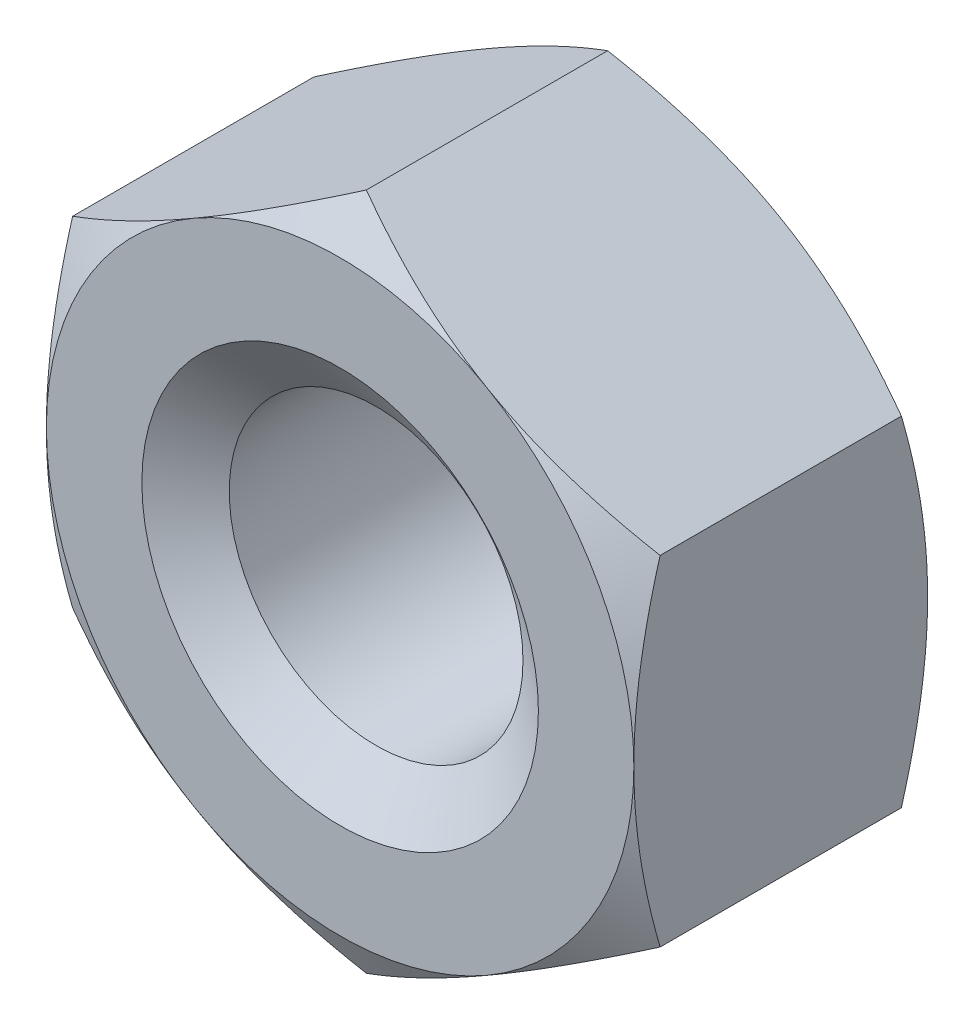
ISO-10303-21;
HEADER;
FILE_DESCRIPTION(('STEP AP214'),'2;1');
FILE_NAME('part.step','',(''),(''),'','','');
FILE_SCHEMA(('AUTOMOTIVE_DESIGN { 1 0 10303 214 1 1 1 1 }'));
ENDSEC;
DATA;
#1=APPLICATION_CONTEXT('core data for automotive mechanical design processes');
#2=APPLICATION_PROTOCOL_DEFINITION('international standard','automotive_design',2000,#1);
#3=PRODUCT_CONTEXT('',#1,'mechanical');
#4=PRODUCT('Part','Part','',(#3));
#5=PRODUCT_RELATED_PRODUCT_CATEGORY('part','',(#4));
#6=PRODUCT_DEFINITION_FORMATION('','',#4);
#7=PRODUCT_DEFINITION_CONTEXT('part definition',#1,'design');
#8=PRODUCT_DEFINITION('design','',#6,#7);
#9=PRODUCT_DEFINITION_SHAPE('','',#8);
#10=(LENGTH_UNIT() NAMED_UNIT(*) SI_UNIT(.MILLI.,.METRE.));
#11=(NAMED_UNIT(*) PLANE_ANGLE_UNIT() SI_UNIT($,.RADIAN.));
#12=(NAMED_UNIT(*) SI_UNIT($,.STERADIAN.) SOLID_ANGLE_UNIT());
#13=UNCERTAINTY_MEASURE_WITH_UNIT(LENGTH_MEASURE(1.E-05),#10,'distance_accuracy_value','');
#14=(GEOMETRIC_REPRESENTATION_CONTEXT(3) GLOBAL_UNCERTAINTY_ASSIGNED_CONTEXT((#13)) GLOBAL_UNIT_ASSIGNED_CONTEXT((#10,
#11,#12)) REPRESENTATION_CONTEXT('',''));
#15=CARTESIAN_POINT('',(0.,0.,0.));
#16=DIRECTION('',(0.,0.,1.));
#17=DIRECTION('',(1.,0.,0.));
#18=AXIS2_PLACEMENT_3D('',#15,#16,#17);
#19=CARTESIAN_POINT('',(0.,0.,-4.));
#20=DIRECTION('',(0.,0.,1.));
#21=DIRECTION('',(1.,0.,0.));
#22=AXIS2_PLACEMENT_3D('',#19,#20,#21);
#23=CYLINDRICAL_SURFACE('',#22,2.);
#24=CARTESIAN_POINT('',(0.,0.,-0.490145276746797));
#25=DIRECTION('',(0.,0.,1.));
#26=DIRECTION('',(1.,0.,0.));
#27=AXIS2_PLACEMENT_3D('',#24,#25,#26);
#28=CIRCLE('',#27,2.);
#29=CARTESIAN_POINT('',(2.,0.,-0.490145276746797));
#30=VERTEX_POINT('',#29);
#31=EDGE_CURVE('E175',#30,#30,#28,.F.);
#32=ORIENTED_EDGE('',*,*,#31,.F.);
#33=EDGE_LOOP('',(#32));
#34=FACE_BOUND('',#33,.T.);
#35=CARTESIAN_POINT('',(0.,0.,-3.4844547232532));
#36=DIRECTION('',(0.,0.,-1.));
#37=DIRECTION('',(-1.,0.,0.));
#38=AXIS2_PLACEMENT_3D('',#35,#36,#37);
#39=CIRCLE('',#38,2.);
#40=CARTESIAN_POINT('',(-2.,0.,-3.4844547232532));
#41=VERTEX_POINT('',#40);
#42=EDGE_CURVE('E40',#41,#41,#39,.F.);
#43=ORIENTED_EDGE('',*,*,#42,.F.);
#44=EDGE_LOOP('',(#43));
#45=FACE_BOUND('',#44,.T.);
#46=ADVANCED_FACE('F35',(#34,#45),#23,.F.);
#47=CARTESIAN_POINT('',(0.,4.61880215351701,-4.));
#48=DIRECTION('',(0.,0.,-1.));
#49=DIRECTION('',(-1.,0.,0.));
#50=AXIS2_PLACEMENT_3D('',#47,#48,#49);
#51=PLANE('',#50);
#52=CARTESIAN_POINT('',(0.,0.,-4.));
#53=DIRECTION('',(0.,0.,-1.));
#54=DIRECTION('',(-1.,0.,0.));
#55=AXIS2_PLACEMENT_3D('',#52,#53,#54);
#56=CIRCLE('',#55,4.);
#57=CARTESIAN_POINT('',(-4.,0.,-4.));
#58=VERTEX_POINT('',#57);
#59=CARTESIAN_POINT('',(-2.,-3.46410161513775,-4.));
#60=VERTEX_POINT('',#59);
#61=EDGE_CURVE('E171',#58,#60,#56,.F.);
#62=ORIENTED_EDGE('',*,*,#61,.F.);
#63=CARTESIAN_POINT('',(-2.00000000000001,3.46410161513775,-4.));
#64=VERTEX_POINT('',#63);
#65=EDGE_CURVE('E153',#64,#58,#56,.F.);
#66=ORIENTED_EDGE('',*,*,#65,.F.);
#67=CARTESIAN_POINT('',(2.,3.46410161513775,-4.));
#68=VERTEX_POINT('',#67);
#69=EDGE_CURVE('E170',#68,#64,#56,.F.);
#70=ORIENTED_EDGE('',*,*,#69,.F.);
#71=CARTESIAN_POINT('',(0.,0.,-4.));
#72=DIRECTION('',(0.,0.,1.));
#73=DIRECTION('',(1.,0.,0.));
#74=AXIS2_PLACEMENT_3D('',#71,#72,#73);
#75=CIRCLE('',#74,4.);
#76=CARTESIAN_POINT('',(4.,0.,-4.));
#77=VERTEX_POINT('',#76);
#78=EDGE_CURVE('E245',#77,#68,#75,.T.);
#79=ORIENTED_EDGE('',*,*,#78,.F.);
#80=CARTESIAN_POINT('',(2.,-3.46410161513775,-4.));
#81=VERTEX_POINT('',#80);
#82=EDGE_CURVE('E361',#81,#77,#56,.F.);
#83=ORIENTED_EDGE('',*,*,#82,.F.);
#84=EDGE_CURVE('E365',#60,#81,#56,.F.);
#85=ORIENTED_EDGE('',*,*,#84,.F.);
#86=EDGE_LOOP('',(#62,#66,#70,#79,#83,#85));
#87=FACE_BOUND('',#86,.T.);
#88=CARTESIAN_POINT('',(0.,0.,-4.));
#89=DIRECTION('',(0.,0.,-1.));
#90=DIRECTION('',(-1.,0.,0.));
#91=AXIS2_PLACEMENT_3D('',#88,#89,#90);
#92=CIRCLE('',#91,2.7);
#93=CARTESIAN_POINT('',(-2.7,0.,-4.));
#94=VERTEX_POINT('',#93);
#95=EDGE_CURVE('E178',#94,#94,#92,.F.);
#96=ORIENTED_EDGE('',*,*,#95,.T.);
#97=EDGE_LOOP('',(#96));
#98=FACE_BOUND('',#97,.T.);
#99=ADVANCED_FACE('F298',(#87,#98),#51,.T.);
#100=CARTESIAN_POINT('',(0.,4.61880215351701,0.));
#101=DIRECTION('',(0.,0.,-1.));
#102=DIRECTION('',(-1.,0.,0.));
#103=AXIS2_PLACEMENT_3D('',#100,#101,#102);
#104=PLANE('',#103);
#105=CARTESIAN_POINT('',(0.,0.,0.));
#106=DIRECTION('',(0.,0.,-1.));
#107=DIRECTION('',(-1.,0.,0.));
#108=AXIS2_PLACEMENT_3D('',#105,#106,#107);
#109=CIRCLE('',#108,4.);
#110=CARTESIAN_POINT('',(-4.,0.,0.));
#111=VERTEX_POINT('',#110);
#112=CARTESIAN_POINT('',(-2.00000000000001,3.46410161513775,0.));
#113=VERTEX_POINT('',#112);
#114=EDGE_CURVE('E11',#111,#113,#109,.T.);
#115=ORIENTED_EDGE('',*,*,#114,.F.);
#116=CARTESIAN_POINT('',(-2.,-3.46410161513775,0.));
#117=VERTEX_POINT('',#116);
#118=EDGE_CURVE('E47',#117,#111,#109,.T.);
#119=ORIENTED_EDGE('',*,*,#118,.F.);
#120=CARTESIAN_POINT('',(2.,-3.46410161513775,0.));
#121=VERTEX_POINT('',#120);
#122=EDGE_CURVE('E174',#121,#117,#109,.T.);
#123=ORIENTED_EDGE('',*,*,#122,.F.);
#124=CARTESIAN_POINT('',(4.,0.,0.));
#125=VERTEX_POINT('',#124);
#126=EDGE_CURVE('E352',#125,#121,#109,.T.);
#127=ORIENTED_EDGE('',*,*,#126,.F.);
#128=CARTESIAN_POINT('',(0.,0.,0.));
#129=DIRECTION('',(0.,0.,1.));
#130=DIRECTION('',(1.,0.,0.));
#131=AXIS2_PLACEMENT_3D('',#128,#129,#130);
#132=CIRCLE('',#131,4.);
#133=CARTESIAN_POINT('',(2.,3.46410161513775,0.));
#134=VERTEX_POINT('',#133);
#135=EDGE_CURVE('E129',#125,#134,#132,.T.);
#136=ORIENTED_EDGE('',*,*,#135,.T.);
#137=EDGE_CURVE('E45',#113,#134,#109,.T.);
#138=ORIENTED_EDGE('',*,*,#137,.F.);
#139=EDGE_LOOP('',(#115,#119,#123,#127,#136,#138));
#140=FACE_BOUND('',#139,.T.);
#141=CARTESIAN_POINT('',(0.,0.,0.));
#142=DIRECTION('',(0.,0.,1.));
#143=DIRECTION('',(1.,0.,0.));
#144=AXIS2_PLACEMENT_3D('',#141,#142,#143);
#145=CIRCLE('',#144,2.7);
#146=CARTESIAN_POINT('',(2.7,0.,0.));
#147=VERTEX_POINT('',#146);
#148=EDGE_CURVE('E177',#147,#147,#145,.T.);
#149=ORIENTED_EDGE('',*,*,#148,.F.);
#150=EDGE_LOOP('',(#149));
#151=FACE_BOUND('',#150,.T.);
#152=ADVANCED_FACE('F250',(#140,#151),#104,.F.);
#153=CARTESIAN_POINT('',(0.,4.61880215351701,-4.));
#154=DIRECTION('',(-0.500000000000002,0.866025403784438,0.));
#155=DIRECTION('',(-0.866025403784438,-0.500000000000002,0.));
#156=AXIS2_PLACEMENT_3D('',#153,#154,#155);
#157=PLANE('',#156);
#158=DIRECTION('',(0.,0.,1.));
#159=VECTOR('',#158,1.);
#160=CARTESIAN_POINT('',(-4.,2.3094010767585,-4.));
#161=LINE('',#160,#159);
#162=CARTESIAN_POINT('',(-4.,2.30940107675851,-3.64273441009183));
#163=VERTEX_POINT('',#162);
#164=CARTESIAN_POINT('',(-4.,2.3094010767585,-0.357265589908164));
#165=VERTEX_POINT('',#164);
#166=EDGE_CURVE('E165',#163,#165,#161,.T.);
#167=ORIENTED_EDGE('',*,*,#166,.T.);
#168=CARTESIAN_POINT('',(-4.0002,2.30928560670466,-0.357332259074768));
#169=CARTESIAN_POINT('',(-3.82442084967677,2.4107717464617,-0.298717873648283));
#170=CARTESIAN_POINT('',(-3.64712438367362,2.51313390883499,-0.245410321462263));
#171=CARTESIAN_POINT('',(-3.28946140682429,2.71963072479811,-0.152361670746403));
#172=CARTESIAN_POINT('',(-3.10908854102985,2.82376904741904,-0.112653489029704));
#173=CARTESIAN_POINT('',(-2.75057818129721,3.03075510011795,-0.0508422152802782));
#174=CARTESIAN_POINT('',(-2.57249584706486,3.13357098372491,-0.0283277315228877));
#175=CARTESIAN_POINT('',(-2.21549328283349,3.33968651028528,-0.00145062314658087));
#176=CARTESIAN_POINT('',(-2.0365743503559,3.44298540411434,0.0029342585730573));
#177=CARTESIAN_POINT('',(-1.70225715780327,3.63600352522932,-0.00619007293997018));
#178=CARTESIAN_POINT('',(-1.54680884001293,3.72575165335065,-0.0174589539879942));
#179=CARTESIAN_POINT('',(-1.23692494436495,3.90466320392054,-0.0531739907981937));
#180=CARTESIAN_POINT('',(-1.08249043825587,3.99382600759478,-0.0776323457115342));
#181=CARTESIAN_POINT('',(-0.771967672225424,4.17310641015197,-0.138776064919291));
#182=CARTESIAN_POINT('',(-0.6159187119369,4.26320131938131,-0.175720603654866));
#183=CARTESIAN_POINT('',(-0.306148164596163,4.44204742827551,-0.25957007254803));
#184=CARTESIAN_POINT('',(-0.152422609226223,4.53080091904967,-0.306455302212744));
#185=CARTESIAN_POINT('',(0.000199999999997815,4.61891762357085,-0.357332259074771));
#186=B_SPLINE_CURVE_WITH_KNOTS('',3,(#168,#169,#170,#171,#172,#173,#174,#175,#176,#177,#178,
#179,#180,#181,#182,#183,#184,#185),.UNSPECIFIED.,.F.,.F.,(4,2,2,2,2,2,2,2,4),(0.,
0.634047835695966,1.26961969224543,1.88946157213122,2.50854226669297,3.04757825393386,
3.58711366126904,4.13861653143764,4.68903648037743),.UNSPECIFIED.);
#187=EDGE_CURVE('E134',#165,#113,#186,.T.);
#188=ORIENTED_EDGE('',*,*,#187,.T.);
#189=CARTESIAN_POINT('',(0.,4.61880215351701,-0.357265589908167));
#190=VERTEX_POINT('',#189);
#191=EDGE_CURVE('E54',#113,#190,#186,.T.);
#192=ORIENTED_EDGE('',*,*,#191,.T.);
#193=DIRECTION('',(0.,0.,1.));
#194=VECTOR('',#193,1.);
#195=CARTESIAN_POINT('',(0.,4.61880215351701,-4.));
#196=LINE('',#195,#194);
#197=CARTESIAN_POINT('',(0.,4.61880215351701,-3.64273441009183));
#198=VERTEX_POINT('',#197);
#199=EDGE_CURVE('E150',#198,#190,#196,.T.);
#200=ORIENTED_EDGE('',*,*,#199,.F.);
#201=CARTESIAN_POINT('',(-4.0002,2.30928560670466,-3.64266774092523));
#202=CARTESIAN_POINT('',(-3.82442084967677,2.4107717464617,-3.70128212635172));
#203=CARTESIAN_POINT('',(-3.64712438367362,2.51313390883499,-3.75458967853774));
#204=CARTESIAN_POINT('',(-3.28946140682429,2.71963072479811,-3.8476383292536));
#205=CARTESIAN_POINT('',(-3.10908854102985,2.82376904741904,-3.8873465109703));
#206=CARTESIAN_POINT('',(-2.75057818129721,3.03075510011795,-3.94915778471972));
#207=CARTESIAN_POINT('',(-2.57249584706486,3.13357098372491,-3.97167226847711));
#208=CARTESIAN_POINT('',(-2.21549328283349,3.33968651028528,-3.99854937685342));
#209=CARTESIAN_POINT('',(-2.0365743503559,3.44298540411434,-4.00293425857306));
#210=CARTESIAN_POINT('',(-1.70225715780327,3.63600352522932,-3.99380992706003));
#211=CARTESIAN_POINT('',(-1.54680884001293,3.72575165335065,-3.98254104601201));
#212=CARTESIAN_POINT('',(-1.23692494436495,3.90466320392054,-3.94682600920181));
#213=CARTESIAN_POINT('',(-1.08249043825587,3.99382600759479,-3.92236765428847));
#214=CARTESIAN_POINT('',(-0.771967672225424,4.17310641015197,-3.86122393508071));
#215=CARTESIAN_POINT('',(-0.6159187119369,4.26320131938131,-3.82427939634513));
#216=CARTESIAN_POINT('',(-0.306148164596163,4.44204742827551,-3.74042992745197));
#217=CARTESIAN_POINT('',(-0.152422609226223,4.53080091904966,-3.69354469778726));
#218=CARTESIAN_POINT('',(0.000199999999997831,4.61891762357085,-3.64266774092523));
#219=B_SPLINE_CURVE_WITH_KNOTS('',3,(#201,#202,#203,#204,#205,#206,#207,#208,#209,#210,#211,
#212,#213,#214,#215,#216,#217,#218),.UNSPECIFIED.,.F.,.F.,(4,2,2,2,2,2,2,2,4),(0.,
0.634047835695967,1.26961969224543,1.88946157213122,2.50854226669297,3.04757825393386,
3.58711366126904,4.13861653143764,4.68903648037743),.UNSPECIFIED.);
#220=EDGE_CURVE('E168',#64,#198,#219,.T.);
#221=ORIENTED_EDGE('',*,*,#220,.F.);
#222=EDGE_CURVE('E260',#163,#64,#219,.T.);
#223=ORIENTED_EDGE('',*,*,#222,.F.);
#224=EDGE_LOOP('',(#167,#188,#192,#200,#221,#223));
#225=FACE_BOUND('',#224,.T.);
#226=ADVANCED_FACE('F37',(#225),#157,.T.);
#227=CARTESIAN_POINT('',(4.,2.3094010767585,-4.));
#228=DIRECTION('',(0.5,0.866025403784439,0.));
#229=DIRECTION('',(-0.866025403784438,0.5,0.));
#230=AXIS2_PLACEMENT_3D('',#227,#228,#229);
#231=PLANE('',#230);
#232=ORIENTED_EDGE('',*,*,#199,.T.);
#233=CARTESIAN_POINT('',(-0.000200000000002277,4.61891762357085,-0.357332259074771));
#234=CARTESIAN_POINT('',(0.175579150323226,4.51743148381381,-0.298717873648286));
#235=CARTESIAN_POINT('',(0.352875616326379,4.41506932144052,-0.245410321462266));
#236=CARTESIAN_POINT('',(0.710538593175705,4.2085725054774,-0.152361670746405));
#237=CARTESIAN_POINT('',(0.89091145897015,4.10443418285647,-0.112653489029705));
#238=CARTESIAN_POINT('',(1.24942181870279,3.89744813015756,-0.0508422152802795));
#239=CARTESIAN_POINT('',(1.42750415293514,3.79463224655059,-0.0283277315228891));
#240=CARTESIAN_POINT('',(1.78450671716651,3.58851671999023,-0.00145062314658196));
#241=CARTESIAN_POINT('',(1.9634256496441,3.48521782616117,0.00293425857305664));
#242=CARTESIAN_POINT('',(2.29774284219673,3.29219970504619,-0.00619007293997042));
#243=CARTESIAN_POINT('',(2.45319115998707,3.20245157692486,-0.0174589539879944));
#244=CARTESIAN_POINT('',(2.76307505563506,3.02354002635497,-0.0531739907981934));
#245=CARTESIAN_POINT('',(2.91750956174413,2.93437722268073,-0.0776323457115333));
#246=CARTESIAN_POINT('',(3.22803232777458,2.75509682012354,-0.13877606491929));
#247=CARTESIAN_POINT('',(3.3840812880631,2.6650019108942,-0.175720603654864));
#248=CARTESIAN_POINT('',(3.69385183540384,2.48615580200001,-0.259570072548029));
#249=CARTESIAN_POINT('',(3.84757739077378,2.39740231122585,-0.306455302212742));
#250=CARTESIAN_POINT('',(4.0002,2.30928560670466,-0.357332259074769));
#251=B_SPLINE_CURVE_WITH_KNOTS('',3,(#233,#234,#235,#236,#237,#238,#239,#240,#241,#242,#243,
#244,#245,#246,#247,#248,#249,#250),.UNSPECIFIED.,.F.,.F.,(4,2,2,2,2,2,2,2,4),(0.,
0.634047835695967,1.26961969224544,1.88946157213122,2.50854226669297,3.04757825393386,
3.58711366126904,4.13861653143764,4.68903648037744),.UNSPECIFIED.);
#252=EDGE_CURVE('E144',#190,#134,#251,.T.);
#253=ORIENTED_EDGE('',*,*,#252,.T.);
#254=CARTESIAN_POINT('',(4.,2.30940107675851,-0.357265589908167));
#255=VERTEX_POINT('',#254);
#256=EDGE_CURVE('E61',#134,#255,#251,.T.);
#257=ORIENTED_EDGE('',*,*,#256,.T.);
#258=DIRECTION('',(0.,0.,1.));
#259=VECTOR('',#258,1.);
#260=CARTESIAN_POINT('',(4.,2.3094010767585,-4.));
#261=LINE('',#260,#259);
#262=CARTESIAN_POINT('',(4.,2.30940107675851,-3.64273441009183));
#263=VERTEX_POINT('',#262);
#264=EDGE_CURVE('E143',#263,#255,#261,.T.);
#265=ORIENTED_EDGE('',*,*,#264,.F.);
#266=CARTESIAN_POINT('',(-0.000200000000002219,4.61891762357085,-3.64266774092523));
#267=CARTESIAN_POINT('',(0.175579150323226,4.51743148381381,-3.70128212635171));
#268=CARTESIAN_POINT('',(0.352875616326379,4.41506932144052,-3.75458967853773));
#269=CARTESIAN_POINT('',(0.710538593175705,4.2085725054774,-3.84763832925359));
#270=CARTESIAN_POINT('',(0.89091145897015,4.10443418285647,-3.88734651097029));
#271=CARTESIAN_POINT('',(1.24942181870279,3.89744813015756,-3.94915778471972));
#272=CARTESIAN_POINT('',(1.42750415293514,3.79463224655059,-3.97167226847711));
#273=CARTESIAN_POINT('',(1.78450671716651,3.58851671999023,-3.99854937685342));
#274=CARTESIAN_POINT('',(1.9634256496441,3.48521782616117,-4.00293425857306));
#275=CARTESIAN_POINT('',(2.29774284219673,3.29219970504619,-3.99380992706003));
#276=CARTESIAN_POINT('',(2.45319115998707,3.20245157692486,-3.98254104601201));
#277=CARTESIAN_POINT('',(2.76307505563506,3.02354002635497,-3.94682600920181));
#278=CARTESIAN_POINT('',(2.91750956174413,2.93437722268073,-3.92236765428847));
#279=CARTESIAN_POINT('',(3.22803232777458,2.75509682012354,-3.86122393508071));
#280=CARTESIAN_POINT('',(3.3840812880631,2.6650019108942,-3.82427939634514));
#281=CARTESIAN_POINT('',(3.69385183540384,2.48615580200001,-3.74042992745197));
#282=CARTESIAN_POINT('',(3.84757739077378,2.39740231122585,-3.69354469778726));
#283=CARTESIAN_POINT('',(4.0002,2.30928560670466,-3.64266774092523));
#284=B_SPLINE_CURVE_WITH_KNOTS('',3,(#266,#267,#268,#269,#270,#271,#272,#273,#274,#275,#276,
#277,#278,#279,#280,#281,#282,#283),.UNSPECIFIED.,.F.,.F.,(4,2,2,2,2,2,2,2,4),(0.,
0.634047835695967,1.26961969224544,1.88946157213122,2.50854226669297,3.04757825393386,
3.58711366126904,4.13861653143764,4.68903648037744),.UNSPECIFIED.);
#285=EDGE_CURVE('E254',#68,#263,#284,.T.);
#286=ORIENTED_EDGE('',*,*,#285,.F.);
#287=EDGE_CURVE('E259',#198,#68,#284,.T.);
#288=ORIENTED_EDGE('',*,*,#287,.F.);
#289=EDGE_LOOP('',(#232,#253,#257,#265,#286,#288));
#290=FACE_BOUND('',#289,.T.);
#291=ADVANCED_FACE('F141',(#290),#231,.T.);
#292=CARTESIAN_POINT('',(4.,2.3094010767585,-4.));
#293=DIRECTION('',(-1.,0.,0.));
#294=DIRECTION('',(0.,-1.,0.));
#295=AXIS2_PLACEMENT_3D('',#292,#293,#294);
#296=PLANE('',#295);
#297=CARTESIAN_POINT('',(4.,-6.12487341769854,-1.91410751140334));
#298=CARTESIAN_POINT('',(4.,-5.94925074925229,-1.8292369313994));
#299=CARTESIAN_POINT('',(4.,-5.77321285090695,-1.74521003492708));
#300=CARTESIAN_POINT('',(4.,-5.42008207974723,-1.57932571904838));
#301=CARTESIAN_POINT('',(4.,-5.24298903069196,-1.49746867526283));
#302=CARTESIAN_POINT('',(4.,-4.88656680078543,-1.33597494722812));
#303=CARTESIAN_POINT('',(4.,-4.70723062291667,-1.25635364986843));
#304=CARTESIAN_POINT('',(4.,-4.34708428132645,-1.1005309820377));
#305=CARTESIAN_POINT('',(4.,-4.16627419501903,-1.02432943330153));
#306=CARTESIAN_POINT('',(4.,-3.80064784913923,-0.875350961035829));
#307=CARTESIAN_POINT('',(4.,-3.61580965828449,-0.802627566544578));
#308=CARTESIAN_POINT('',(4.,-3.2439530938769,-0.662876458232928));
#309=CARTESIAN_POINT('',(4.,-3.05693448038808,-0.595849378098077));
#310=CARTESIAN_POINT('',(4.,-2.68080364998175,-0.469291898141052));
#311=CARTESIAN_POINT('',(4.,-2.49169685108728,-0.40974556040586));
#312=CARTESIAN_POINT('',(4.,-2.11079485187453,-0.300083438066158));
#313=CARTESIAN_POINT('',(4.,-1.91900052241685,-0.249964671183527));
#314=CARTESIAN_POINT('',(4.,-1.53259243721996,-0.161590815968268));
#315=CARTESIAN_POINT('',(4.,-1.3379779447785,-0.123338888256898));
#316=CARTESIAN_POINT('',(4.,-0.946402576855859,-0.0612742138769816));
#317=CARTESIAN_POINT('',(4.,-0.749441699301858,-0.0374614799650977));
#318=CARTESIAN_POINT('',(4.,-0.355451577931474,-0.0063817896182809));
#319=CARTESIAN_POINT('',(4.,-0.158430812125968,0.000989914624613907));
#320=CARTESIAN_POINT('',(4.,0.235472757633437,-0.0012040867487727));
#321=CARTESIAN_POINT('',(4.,0.432355584124888,-0.0107653957626055));
#322=CARTESIAN_POINT('',(4.,0.768561502729881,-0.0408788287570051));
#323=CARTESIAN_POINT('',(4.,0.90825551074493,-0.0575094098780465));
#324=CARTESIAN_POINT('',(4.,1.18656443167127,-0.0982135646467313));
#325=CARTESIAN_POINT('',(4.,1.3251791708607,-0.122288312133848));
#326=CARTESIAN_POINT('',(4.,1.73929148967673,-0.204415308856755));
#327=CARTESIAN_POINT('',(4.,2.01284798562143,-0.272349166850978));
#328=CARTESIAN_POINT('',(4.,2.4221836780155,-0.389516702639779));
#329=CARTESIAN_POINT('',(4.,2.5600965343711,-0.431714306251332));
#330=CARTESIAN_POINT('',(4.,2.83448280728084,-0.520284986292434));
#331=CARTESIAN_POINT('',(4.,2.97095714512838,-0.566655182759159));
#332=CARTESIAN_POINT('',(4.,3.24189568898007,-0.662606165964738));
#333=CARTESIAN_POINT('',(4.,3.37636688558444,-0.712167412243156));
#334=CARTESIAN_POINT('',(4.,3.64426596229273,-0.814198879097272));
#335=CARTESIAN_POINT('',(4.,3.77769339550527,-0.866670275382276));
#336=CARTESIAN_POINT('',(4.,3.91063838536382,-0.920309569779408));
#337=B_SPLINE_CURVE_WITH_KNOTS('',3,(#297,#298,#299,#300,#301,#302,#303,#304,#305,#306,#307,
#308,#309,#310,#311,#312,#313,#314,#315,#316,#317,#318,#319,#320,#321,#322,#323,#324,#325,#326,
#327,#328,#329,#330,#331,#332,#333,#334,#335,#336),.UNSPECIFIED.,.F.,.F.,(4,2,2,2,2,2,2,2,2,2,2,
2,2,2,2,2,2,2,2,4),(0.,0.585171963095452,1.17044457175393,1.75906646017956,2.34765762911912,
2.94347487147066,3.5393583088869,4.13394985840931,4.72835299985964,5.32291431936074,
5.91747616414099,6.50823902912396,7.09884852691631,7.520683919592,7.94258586367793,
8.78701766848809,9.21965565808344,9.65199729435843,10.0819054210591,10.5119885153524),.UNSPECIFIED.);
#338=CARTESIAN_POINT('',(4.,-2.3094010767585,-0.357265589908167));
#339=VERTEX_POINT('',#338);
#340=EDGE_CURVE('E136',#339,#125,#337,.T.);
#341=ORIENTED_EDGE('',*,*,#340,.F.);
#342=DIRECTION('',(0.,0.,1.));
#343=VECTOR('',#342,1.);
#344=CARTESIAN_POINT('',(4.,-2.30940107675851,-4.));
#345=LINE('',#344,#343);
#346=CARTESIAN_POINT('',(4.,-2.3094010767585,-3.64273441009183));
#347=VERTEX_POINT('',#346);
#348=EDGE_CURVE('E151',#347,#339,#345,.T.);
#349=ORIENTED_EDGE('',*,*,#348,.F.);
#350=CARTESIAN_POINT('',(4.,-6.12487341769854,-2.08589248859667));
#351=CARTESIAN_POINT('',(4.,-5.94925074925229,-2.1707630686006));
#352=CARTESIAN_POINT('',(4.,-5.77321285090695,-2.25478996507292));
#353=CARTESIAN_POINT('',(4.,-5.42008207974723,-2.42067428095162));
#354=CARTESIAN_POINT('',(4.,-5.24298903069196,-2.50253132473717));
#355=CARTESIAN_POINT('',(4.,-4.88656680078543,-2.66402505277188));
#356=CARTESIAN_POINT('',(4.,-4.70723062291667,-2.74364635013157));
#357=CARTESIAN_POINT('',(4.,-4.34708428132645,-2.8994690179623));
#358=CARTESIAN_POINT('',(4.,-4.16627419501903,-2.97567056669847));
#359=CARTESIAN_POINT('',(4.,-3.80064784913924,-3.12464903896417));
#360=CARTESIAN_POINT('',(4.,-3.6158096582845,-3.19737243345542));
#361=CARTESIAN_POINT('',(4.,-3.2439530938769,-3.33712354176707));
#362=CARTESIAN_POINT('',(4.,-3.05693448038808,-3.40415062190192));
#363=CARTESIAN_POINT('',(4.,-2.68080364998175,-3.53070810185895));
#364=CARTESIAN_POINT('',(4.,-2.49169685108728,-3.59025443959414));
#365=CARTESIAN_POINT('',(4.,-2.11079485187453,-3.69991656193384));
#366=CARTESIAN_POINT('',(4.,-1.91900052241685,-3.75003532881647));
#367=CARTESIAN_POINT('',(4.,-1.53259243721996,-3.83840918403173));
#368=CARTESIAN_POINT('',(4.,-1.3379779447785,-3.8766611117431));
#369=CARTESIAN_POINT('',(4.,-0.946402576855859,-3.93872578612302));
#370=CARTESIAN_POINT('',(4.,-0.749441699301858,-3.9625385200349));
#371=CARTESIAN_POINT('',(4.,-0.355451577931474,-3.99361821038172));
#372=CARTESIAN_POINT('',(4.,-0.158430812125967,-4.00098991462461));
#373=CARTESIAN_POINT('',(4.,0.235472757633437,-3.99879591325123));
#374=CARTESIAN_POINT('',(4.,0.432355584124888,-3.98923460423739));
#375=CARTESIAN_POINT('',(4.,0.768561502729881,-3.959121171243));
#376=CARTESIAN_POINT('',(4.,0.90825551074493,-3.94249059012195));
#377=CARTESIAN_POINT('',(4.,1.18656443167127,-3.90178643535327));
#378=CARTESIAN_POINT('',(4.,1.3251791708607,-3.87771168786615));
#379=CARTESIAN_POINT('',(4.,1.73929148967673,-3.79558469114325));
#380=CARTESIAN_POINT('',(4.,2.01284798562143,-3.72765083314902));
#381=CARTESIAN_POINT('',(4.,2.4221836780155,-3.61048329736022));
#382=CARTESIAN_POINT('',(4.,2.5600965343711,-3.56828569374867));
#383=CARTESIAN_POINT('',(4.,2.83448280728085,-3.47971501370757));
#384=CARTESIAN_POINT('',(4.,2.97095714512838,-3.43334481724084));
#385=CARTESIAN_POINT('',(4.,3.24189568898007,-3.33739383403526));
#386=CARTESIAN_POINT('',(4.,3.37636688558444,-3.28783258775684));
#387=CARTESIAN_POINT('',(4.,3.64426596229274,-3.18580112090273));
#388=CARTESIAN_POINT('',(4.,3.77769339550528,-3.13332972461772));
#389=CARTESIAN_POINT('',(4.,3.91063838536382,-3.07969043022059));
#390=B_SPLINE_CURVE_WITH_KNOTS('',3,(#350,#351,#352,#353,#354,#355,#356,#357,#358,#359,#360,
#361,#362,#363,#364,#365,#366,#367,#368,#369,#370,#371,#372,#373,#374,#375,#376,#377,#378,#379,
#380,#381,#382,#383,#384,#385,#386,#387,#388,#389),.UNSPECIFIED.,.F.,.F.,(4,2,2,2,2,2,2,2,2,2,2,
2,2,2,2,2,2,2,2,4),(0.,0.585171963095452,1.17044457175393,1.75906646017956,2.34765762911912,
2.94347487147065,3.5393583088869,4.13394985840931,4.72835299985964,5.32291431936074,
5.91747616414099,6.50823902912396,7.09884852691631,7.520683919592,7.94258586367793,
8.78701766848809,9.21965565808344,9.65199729435843,10.0819054210591,10.5119885153524),.UNSPECIFIED.);
#391=EDGE_CURVE('E266',#347,#77,#390,.T.);
#392=ORIENTED_EDGE('',*,*,#391,.T.);
#393=EDGE_CURVE('E149',#77,#263,#390,.T.);
#394=ORIENTED_EDGE('',*,*,#393,.T.);
#395=ORIENTED_EDGE('',*,*,#264,.T.);
#396=EDGE_CURVE('E126',#125,#255,#337,.T.);
#397=ORIENTED_EDGE('',*,*,#396,.F.);
#398=EDGE_LOOP('',(#341,#349,#392,#394,#395,#397));
#399=FACE_BOUND('',#398,.T.);
#400=ADVANCED_FACE('F147',(#399),#296,.F.);
#401=CARTESIAN_POINT('',(0.,-4.61880215351701,-4.));
#402=DIRECTION('',(0.500000000000001,-0.866025403784438,0.));
#403=DIRECTION('',(0.866025403784438,0.500000000000001,0.));
#404=AXIS2_PLACEMENT_3D('',#401,#402,#403);
#405=PLANE('',#404);
#406=ORIENTED_EDGE('',*,*,#348,.T.);
#407=CARTESIAN_POINT('',(4.0002,-2.30928560670467,-0.357332259074771));
#408=CARTESIAN_POINT('',(3.82442084967677,-2.41077174646171,-0.298717873648286));
#409=CARTESIAN_POINT('',(3.64712438367362,-2.513133908835,-0.245410321462265));
#410=CARTESIAN_POINT('',(3.28946140682429,-2.71963072479812,-0.152361670746406));
#411=CARTESIAN_POINT('',(3.10908854102985,-2.82376904741905,-0.112653489029706));
#412=CARTESIAN_POINT('',(2.75057818129721,-3.03075510011796,-0.0508422152802813));
#413=CARTESIAN_POINT('',(2.57249584706486,-3.13357098372492,-0.0283277315228912));
#414=CARTESIAN_POINT('',(2.21549328283349,-3.33968651028529,-0.00145062314658419));
#415=CARTESIAN_POINT('',(2.0365743503559,-3.44298540411435,0.00293425857305446));
#416=CARTESIAN_POINT('',(1.70225715780327,-3.63600352522933,-0.0061900729399733));
#417=CARTESIAN_POINT('',(1.54680884001293,-3.72575165335065,-0.0174589539879979));
#418=CARTESIAN_POINT('',(1.23692494436494,-3.90466320392055,-0.0531739907981976));
#419=CARTESIAN_POINT('',(1.08249043825587,-3.99382600759479,-0.0776323457115377));
#420=CARTESIAN_POINT('',(0.771967672225422,-4.17310641015198,-0.138776064919295));
#421=CARTESIAN_POINT('',(0.615918711936898,-4.26320131938132,-0.175720603654869));
#422=CARTESIAN_POINT('',(0.306148164596161,-4.44204742827551,-0.259570072548034));
#423=CARTESIAN_POINT('',(0.152422609226222,-4.53080091904967,-0.306455302212747));
#424=CARTESIAN_POINT('',(-0.000199999999998104,-4.61891762357085,-0.357332259074774));
#425=B_SPLINE_CURVE_WITH_KNOTS('',3,(#407,#408,#409,#410,#411,#412,#413,#414,#415,#416,#417,
#418,#419,#420,#421,#422,#423,#424),.UNSPECIFIED.,.F.,.F.,(4,2,2,2,2,2,2,2,4),(0.,
0.634047835695967,1.26961969224544,1.88946157213123,2.50854226669298,3.04757825393386,
3.58711366126904,4.13861653143764,4.68903648037743),.UNSPECIFIED.);
#426=EDGE_CURVE('E347',#339,#121,#425,.T.);
#427=ORIENTED_EDGE('',*,*,#426,.T.);
#428=CARTESIAN_POINT('',(0.,-4.61880215351701,-0.357265589908167));
#429=VERTEX_POINT('',#428);
#430=EDGE_CURVE('E226',#121,#429,#425,.T.);
#431=ORIENTED_EDGE('',*,*,#430,.T.);
#432=DIRECTION('',(0.,0.,1.));
#433=VECTOR('',#432,1.);
#434=CARTESIAN_POINT('',(0.,-4.61880215351701,-4.));
#435=LINE('',#434,#433);
#436=CARTESIAN_POINT('',(0.,-4.61880215351701,-3.64273441009183));
#437=VERTEX_POINT('',#436);
#438=EDGE_CURVE('E156',#437,#429,#435,.T.);
#439=ORIENTED_EDGE('',*,*,#438,.F.);
#440=CARTESIAN_POINT('',(4.0002,-2.30928560670467,-3.64266774092523));
#441=CARTESIAN_POINT('',(3.82442084967677,-2.41077174646171,-3.70128212635171));
#442=CARTESIAN_POINT('',(3.64712438367362,-2.513133908835,-3.75458967853773));
#443=CARTESIAN_POINT('',(3.28946140682429,-2.71963072479812,-3.84763832925359));
#444=CARTESIAN_POINT('',(3.10908854102985,-2.82376904741905,-3.88734651097029));
#445=CARTESIAN_POINT('',(2.75057818129721,-3.03075510011796,-3.94915778471972));
#446=CARTESIAN_POINT('',(2.57249584706486,-3.13357098372492,-3.97167226847711));
#447=CARTESIAN_POINT('',(2.21549328283349,-3.33968651028529,-3.99854937685342));
#448=CARTESIAN_POINT('',(2.0365743503559,-3.44298540411435,-4.00293425857305));
#449=CARTESIAN_POINT('',(1.70225715780327,-3.63600352522933,-3.99380992706003));
#450=CARTESIAN_POINT('',(1.54680884001293,-3.72575165335065,-3.982541046012));
#451=CARTESIAN_POINT('',(1.23692494436494,-3.90466320392055,-3.9468260092018));
#452=CARTESIAN_POINT('',(1.08249043825587,-3.99382600759479,-3.92236765428846));
#453=CARTESIAN_POINT('',(0.771967672225422,-4.17310641015198,-3.86122393508071));
#454=CARTESIAN_POINT('',(0.615918711936899,-4.26320131938132,-3.82427939634513));
#455=CARTESIAN_POINT('',(0.306148164596162,-4.44204742827551,-3.74042992745197));
#456=CARTESIAN_POINT('',(0.152422609226223,-4.53080091904967,-3.69354469778725));
#457=CARTESIAN_POINT('',(-0.000199999999998268,-4.61891762357085,-3.64266774092523));
#458=B_SPLINE_CURVE_WITH_KNOTS('',3,(#440,#441,#442,#443,#444,#445,#446,#447,#448,#449,#450,
#451,#452,#453,#454,#455,#456,#457),.UNSPECIFIED.,.F.,.F.,(4,2,2,2,2,2,2,2,4),(0.,
0.634047835695967,1.26961969224544,1.88946157213122,2.50854226669297,3.04757825393386,
3.58711366126904,4.13861653143764,4.68903648037743),.UNSPECIFIED.);
#459=EDGE_CURVE('E272',#81,#437,#458,.T.);
#460=ORIENTED_EDGE('',*,*,#459,.F.);
#461=EDGE_CURVE('E271',#347,#81,#458,.T.);
#462=ORIENTED_EDGE('',*,*,#461,.F.);
#463=EDGE_LOOP('',(#406,#427,#431,#439,#460,#462));
#464=FACE_BOUND('',#463,.T.);
#465=ADVANCED_FACE('F282',(#464),#405,.T.);
#466=CARTESIAN_POINT('',(-4.,-2.30940107675851,-4.));
#467=DIRECTION('',(-0.5,-0.866025403784439,0.));
#468=DIRECTION('',(0.866025403784439,-0.5,0.));
#469=AXIS2_PLACEMENT_3D('',#466,#467,#468);
#470=PLANE('',#469);
#471=ORIENTED_EDGE('',*,*,#438,.T.);
#472=CARTESIAN_POINT('',(0.000200000000001626,-4.61891762357085,-0.357332259074774));
#473=CARTESIAN_POINT('',(-0.175579150323227,-4.51743148381381,-0.298717873648289));
#474=CARTESIAN_POINT('',(-0.35287561632638,-4.41506932144052,-0.245410321462269));
#475=CARTESIAN_POINT('',(-0.710538593175708,-4.2085725054774,-0.152361670746409));
#476=CARTESIAN_POINT('',(-0.890911458970153,-4.10443418285647,-0.112653489029709));
#477=CARTESIAN_POINT('',(-1.24942181870279,-3.89744813015757,-0.0508422152802832));
#478=CARTESIAN_POINT('',(-1.42750415293515,-3.7946322465506,-0.0283277315228927));
#479=CARTESIAN_POINT('',(-1.78450671716651,-3.58851671999023,-0.0014506231465854));
#480=CARTESIAN_POINT('',(-1.96342564964411,-3.48521782616117,0.00293425857305331));
#481=CARTESIAN_POINT('',(-2.29774284219674,-3.29219970504619,-0.00619007293997406));
#482=CARTESIAN_POINT('',(-2.45319115998707,-3.20245157692487,-0.0174589539879983));
#483=CARTESIAN_POINT('',(-2.76307505563506,-3.02354002635497,-0.0531739907981974));
#484=CARTESIAN_POINT('',(-2.91750956174413,-2.93437722268073,-0.0776323457115371));
#485=CARTESIAN_POINT('',(-3.22803232777458,-2.75509682012355,-0.138776064919294));
#486=CARTESIAN_POINT('',(-3.3840812880631,-2.66500191089421,-0.175720603654868));
#487=CARTESIAN_POINT('',(-3.69385183540384,-2.48615580200001,-0.259570072548032));
#488=CARTESIAN_POINT('',(-3.84757739077378,-2.39740231122585,-0.306455302212745));
#489=CARTESIAN_POINT('',(-4.0002,-2.30928560670467,-0.357332259074772));
#490=B_SPLINE_CURVE_WITH_KNOTS('',3,(#472,#473,#474,#475,#476,#477,#478,#479,#480,#481,#482,
#483,#484,#485,#486,#487,#488,#489),.UNSPECIFIED.,.F.,.F.,(4,2,2,2,2,2,2,2,4),(0.,
0.634047835695968,1.26961969224544,1.88946157213123,2.50854226669298,3.04757825393386,
3.58711366126904,4.13861653143764,4.68903648037743),.UNSPECIFIED.);
#491=EDGE_CURVE('E345',#429,#117,#490,.T.);
#492=ORIENTED_EDGE('',*,*,#491,.T.);
#493=CARTESIAN_POINT('',(-4.,-2.30940107675851,-0.357265589908167));
#494=VERTEX_POINT('',#493);
#495=EDGE_CURVE('E200',#117,#494,#490,.T.);
#496=ORIENTED_EDGE('',*,*,#495,.T.);
#497=DIRECTION('',(0.,0.,1.));
#498=VECTOR('',#497,1.);
#499=CARTESIAN_POINT('',(-4.,-2.30940107675851,-4.));
#500=LINE('',#499,#498);
#501=CARTESIAN_POINT('',(-4.,-2.30940107675851,-3.64273441009183));
#502=VERTEX_POINT('',#501);
#503=EDGE_CURVE('E162',#502,#494,#500,.T.);
#504=ORIENTED_EDGE('',*,*,#503,.F.);
#505=CARTESIAN_POINT('',(0.000200000000001626,-4.61891762357085,-3.64266774092523));
#506=CARTESIAN_POINT('',(-0.175579150323227,-4.51743148381381,-3.70128212635171));
#507=CARTESIAN_POINT('',(-0.35287561632638,-4.41506932144052,-3.75458967853773));
#508=CARTESIAN_POINT('',(-0.710538593175707,-4.2085725054774,-3.84763832925359));
#509=CARTESIAN_POINT('',(-0.890911458970152,-4.10443418285648,-3.88734651097029));
#510=CARTESIAN_POINT('',(-1.24942181870279,-3.89744813015757,-3.94915778471972));
#511=CARTESIAN_POINT('',(-1.42750415293514,-3.7946322465506,-3.97167226847711));
#512=CARTESIAN_POINT('',(-1.78450671716651,-3.58851671999023,-3.99854937685341));
#513=CARTESIAN_POINT('',(-1.9634256496441,-3.48521782616117,-4.00293425857305));
#514=CARTESIAN_POINT('',(-2.29774284219674,-3.29219970504619,-3.99380992706003));
#515=CARTESIAN_POINT('',(-2.45319115998707,-3.20245157692487,-3.982541046012));
#516=CARTESIAN_POINT('',(-2.76307505563506,-3.02354002635497,-3.9468260092018));
#517=CARTESIAN_POINT('',(-2.91750956174413,-2.93437722268073,-3.92236765428846));
#518=CARTESIAN_POINT('',(-3.22803232777458,-2.75509682012355,-3.86122393508071));
#519=CARTESIAN_POINT('',(-3.3840812880631,-2.66500191089421,-3.82427939634513));
#520=CARTESIAN_POINT('',(-3.69385183540384,-2.48615580200001,-3.74042992745197));
#521=CARTESIAN_POINT('',(-3.84757739077378,-2.39740231122585,-3.69354469778726));
#522=CARTESIAN_POINT('',(-4.0002,-2.30928560670467,-3.64266774092523));
#523=B_SPLINE_CURVE_WITH_KNOTS('',3,(#505,#506,#507,#508,#509,#510,#511,#512,#513,#514,#515,
#516,#517,#518,#519,#520,#521,#522),.UNSPECIFIED.,.F.,.F.,(4,2,2,2,2,2,2,2,4),(0.,
0.634047835695968,1.26961969224544,1.88946157213123,2.50854226669298,3.04757825393386,
3.58711366126904,4.13861653143764,4.68903648037744),.UNSPECIFIED.);
#524=EDGE_CURVE('E278',#60,#502,#523,.T.);
#525=ORIENTED_EDGE('',*,*,#524,.F.);
#526=EDGE_CURVE('E277',#437,#60,#523,.T.);
#527=ORIENTED_EDGE('',*,*,#526,.F.);
#528=EDGE_LOOP('',(#471,#492,#496,#504,#525,#527));
#529=FACE_BOUND('',#528,.T.);
#530=ADVANCED_FACE('F285',(#529),#470,.T.);
#531=CARTESIAN_POINT('',(-4.,2.3094010767585,-4.));
#532=DIRECTION('',(-1.,0.,0.));
#533=DIRECTION('',(0.,-1.,0.));
#534=AXIS2_PLACEMENT_3D('',#531,#532,#533);
#535=PLANE('',#534);
#536=ORIENTED_EDGE('',*,*,#503,.T.);
#537=CARTESIAN_POINT('',(-4.,-6.12487341769855,-1.91410751140334));
#538=CARTESIAN_POINT('',(-4.,-5.94925074925229,-1.82923693139941));
#539=CARTESIAN_POINT('',(-4.,-5.77321285090696,-1.74521003492708));
#540=CARTESIAN_POINT('',(-4.,-5.42008207974723,-1.57932571904839));
#541=CARTESIAN_POINT('',(-4.,-5.24298903069197,-1.49746867526284));
#542=CARTESIAN_POINT('',(-4.,-4.88656680078544,-1.33597494722812));
#543=CARTESIAN_POINT('',(-4.,-4.70723062291668,-1.25635364986844));
#544=CARTESIAN_POINT('',(-4.,-4.34708428132646,-1.1005309820377));
#545=CARTESIAN_POINT('',(-4.,-4.16627419501904,-1.02432943330154));
#546=CARTESIAN_POINT('',(-4.,-3.80064784913924,-0.875350961035833));
#547=CARTESIAN_POINT('',(-4.,-3.6158096582845,-0.802627566544582));
#548=CARTESIAN_POINT('',(-4.,-3.24395309387691,-0.662876458232931));
#549=CARTESIAN_POINT('',(-4.,-3.05693448038808,-0.595849378098079));
#550=CARTESIAN_POINT('',(-4.,-2.68080364998176,-0.469291898141054));
#551=CARTESIAN_POINT('',(-4.,-2.49169685108729,-0.409745560405862));
#552=CARTESIAN_POINT('',(-4.,-2.11079485187453,-0.30008343806616));
#553=CARTESIAN_POINT('',(-4.,-1.91900052241685,-0.249964671183529));
#554=CARTESIAN_POINT('',(-4.,-1.53259243721996,-0.16159081596827));
#555=CARTESIAN_POINT('',(-4.,-1.33797794477851,-0.123338888256899));
#556=CARTESIAN_POINT('',(-4.,-0.946402576855864,-0.0612742138769819));
#557=CARTESIAN_POINT('',(-4.,-0.749441699301863,-0.0374614799650982));
#558=CARTESIAN_POINT('',(-4.,-0.355451577931478,-0.00638178961828139));
#559=CARTESIAN_POINT('',(-4.,-0.158430812125972,0.000989914624613622));
#560=CARTESIAN_POINT('',(-4.,0.235472757633433,-0.00120408674877241));
#561=CARTESIAN_POINT('',(-4.,0.432355584124884,-0.0107653957626048));
#562=CARTESIAN_POINT('',(-4.,0.768561502729877,-0.0408788287570047));
#563=CARTESIAN_POINT('',(-4.,0.908255510744925,-0.0575094098780466));
#564=CARTESIAN_POINT('',(-4.,1.18656443167126,-0.0982135646467312));
#565=CARTESIAN_POINT('',(-4.,1.32517917086069,-0.122288312133847));
#566=CARTESIAN_POINT('',(-4.,1.73929148967672,-0.204415308856753));
#567=CARTESIAN_POINT('',(-4.,2.01284798562142,-0.272349166850977));
#568=CARTESIAN_POINT('',(-4.,2.42218367801549,-0.389516702639777));
#569=CARTESIAN_POINT('',(-4.,2.56009653437109,-0.43171430625133));
#570=CARTESIAN_POINT('',(-4.,2.83448280728084,-0.520284986292431));
#571=CARTESIAN_POINT('',(-4.,2.97095714512837,-0.566655182759157));
#572=CARTESIAN_POINT('',(-4.,3.24189568898006,-0.662606165964736));
#573=CARTESIAN_POINT('',(-4.,3.37636688558443,-0.712167412243154));
#574=CARTESIAN_POINT('',(-4.,3.64426596229273,-0.81419887909727));
#575=CARTESIAN_POINT('',(-4.,3.77769339550527,-0.866670275382274));
#576=CARTESIAN_POINT('',(-4.,3.91063838536381,-0.920309569779405));
#577=B_SPLINE_CURVE_WITH_KNOTS('',3,(#537,#538,#539,#540,#541,#542,#543,#544,#545,#546,#547,
#548,#549,#550,#551,#552,#553,#554,#555,#556,#557,#558,#559,#560,#561,#562,#563,#564,#565,#566,
#567,#568,#569,#570,#571,#572,#573,#574,#575,#576),.UNSPECIFIED.,.F.,.F.,(4,2,2,2,2,2,2,2,2,2,2,
2,2,2,2,2,2,2,2,4),(0.,0.585171963095451,1.17044457175392,1.75906646017956,2.34765762911912,
2.94347487147065,3.5393583088869,4.13394985840932,4.72835299985964,5.32291431936074,
5.91747616414099,6.50823902912397,7.09884852691632,7.520683919592,7.94258586367793,
8.78701766848809,9.21965565808344,9.65199729435843,10.0819054210591,10.5119885153524),.UNSPECIFIED.);
#578=EDGE_CURVE('E199',#494,#111,#577,.T.);
#579=ORIENTED_EDGE('',*,*,#578,.T.);
#580=EDGE_CURVE('E192',#111,#165,#577,.T.);
#581=ORIENTED_EDGE('',*,*,#580,.T.);
#582=ORIENTED_EDGE('',*,*,#166,.F.);
#583=CARTESIAN_POINT('',(-4.,-6.12487341769855,-2.08589248859666));
#584=CARTESIAN_POINT('',(-4.,-5.94925074925229,-2.17076306860059));
#585=CARTESIAN_POINT('',(-4.,-5.77321285090696,-2.25478996507292));
#586=CARTESIAN_POINT('',(-4.,-5.42008207974723,-2.42067428095162));
#587=CARTESIAN_POINT('',(-4.,-5.24298903069196,-2.50253132473717));
#588=CARTESIAN_POINT('',(-4.,-4.88656680078543,-2.66402505277188));
#589=CARTESIAN_POINT('',(-4.,-4.70723062291668,-2.74364635013157));
#590=CARTESIAN_POINT('',(-4.,-4.34708428132646,-2.8994690179623));
#591=CARTESIAN_POINT('',(-4.,-4.16627419501904,-2.97567056669846));
#592=CARTESIAN_POINT('',(-4.,-3.80064784913924,-3.12464903896417));
#593=CARTESIAN_POINT('',(-4.,-3.6158096582845,-3.19737243345542));
#594=CARTESIAN_POINT('',(-4.,-3.24395309387691,-3.33712354176707));
#595=CARTESIAN_POINT('',(-4.,-3.05693448038808,-3.40415062190192));
#596=CARTESIAN_POINT('',(-4.,-2.68080364998176,-3.53070810185895));
#597=CARTESIAN_POINT('',(-4.,-2.49169685108729,-3.59025443959414));
#598=CARTESIAN_POINT('',(-4.,-2.11079485187453,-3.69991656193384));
#599=CARTESIAN_POINT('',(-4.,-1.91900052241685,-3.75003532881647));
#600=CARTESIAN_POINT('',(-4.,-1.53259243721996,-3.83840918403173));
#601=CARTESIAN_POINT('',(-4.,-1.3379779447785,-3.8766611117431));
#602=CARTESIAN_POINT('',(-4.,-0.946402576855862,-3.93872578612302));
#603=CARTESIAN_POINT('',(-4.,-0.749441699301861,-3.9625385200349));
#604=CARTESIAN_POINT('',(-4.,-0.355451577931477,-3.99361821038172));
#605=CARTESIAN_POINT('',(-4.,-0.158430812125971,-4.00098991462461));
#606=CARTESIAN_POINT('',(-4.,0.235472757633433,-3.99879591325123));
#607=CARTESIAN_POINT('',(-4.,0.432355584124884,-3.9892346042374));
#608=CARTESIAN_POINT('',(-4.,0.768561502729877,-3.959121171243));
#609=CARTESIAN_POINT('',(-4.,0.908255510744926,-3.94249059012195));
#610=CARTESIAN_POINT('',(-4.,1.18656443167126,-3.90178643535327));
#611=CARTESIAN_POINT('',(-4.,1.3251791708607,-3.87771168786615));
#612=CARTESIAN_POINT('',(-4.,1.73929148967673,-3.79558469114325));
#613=CARTESIAN_POINT('',(-4.,2.01284798562143,-3.72765083314902));
#614=CARTESIAN_POINT('',(-4.,2.42218367801549,-3.61048329736022));
#615=CARTESIAN_POINT('',(-4.,2.5600965343711,-3.56828569374867));
#616=CARTESIAN_POINT('',(-4.,2.83448280728084,-3.47971501370757));
#617=CARTESIAN_POINT('',(-4.,2.97095714512838,-3.43334481724084));
#618=CARTESIAN_POINT('',(-4.,3.24189568898006,-3.33739383403526));
#619=CARTESIAN_POINT('',(-4.,3.37636688558444,-3.28783258775685));
#620=CARTESIAN_POINT('',(-4.,3.64426596229273,-3.18580112090273));
#621=CARTESIAN_POINT('',(-4.,3.77769339550527,-3.13332972461773));
#622=CARTESIAN_POINT('',(-4.,3.91063838536382,-3.07969043022059));
#623=B_SPLINE_CURVE_WITH_KNOTS('',3,(#583,#584,#585,#586,#587,#588,#589,#590,#591,#592,#593,
#594,#595,#596,#597,#598,#599,#600,#601,#602,#603,#604,#605,#606,#607,#608,#609,#610,#611,#612,
#613,#614,#615,#616,#617,#618,#619,#620,#621,#622),.UNSPECIFIED.,.F.,.F.,(4,2,2,2,2,2,2,2,2,2,2,
2,2,2,2,2,2,2,2,4),(0.,0.585171963095452,1.17044457175393,1.75906646017956,2.34765762911912,
2.94347487147066,3.5393583088869,4.13394985840932,4.72835299985964,5.32291431936074,
5.91747616414099,6.50823902912397,7.09884852691632,7.520683919592,7.94258586367793,
8.7870176684881,9.21965565808345,9.65199729435844,10.0819054210591,10.5119885153524),.UNSPECIFIED.);
#624=EDGE_CURVE('E381',#58,#163,#623,.T.);
#625=ORIENTED_EDGE('',*,*,#624,.F.);
#626=EDGE_CURVE('E385',#502,#58,#623,.T.);
#627=ORIENTED_EDGE('',*,*,#626,.F.);
#628=EDGE_LOOP('',(#536,#579,#581,#582,#625,#627));
#629=FACE_BOUND('',#628,.T.);
#630=ADVANCED_FACE('F206',(#629),#535,.T.);
#631=CARTESIAN_POINT('',(0.,0.,-4.));
#632=DIRECTION('',(0.,0.,1.));
#633=DIRECTION('',(1.,0.,0.));
#634=AXIS2_PLACEMENT_3D('',#631,#632,#633);
#635=CONICAL_SURFACE('',#634,4.,1.0471975511966);
#636=ORIENTED_EDGE('',*,*,#222,.T.);
#637=ORIENTED_EDGE('',*,*,#65,.T.);
#638=ORIENTED_EDGE('',*,*,#624,.T.);
#639=EDGE_LOOP('',(#636,#637,#638));
#640=FACE_BOUND('',#639,.T.);
#641=ADVANCED_FACE('F295',(#640),#635,.T.);
#642=ORIENTED_EDGE('',*,*,#220,.T.);
#643=ORIENTED_EDGE('',*,*,#287,.T.);
#644=ORIENTED_EDGE('',*,*,#69,.T.);
#645=EDGE_LOOP('',(#642,#643,#644));
#646=FACE_BOUND('',#645,.T.);
#647=ADVANCED_FACE('F373',(#646),#635,.T.);
#648=ORIENTED_EDGE('',*,*,#285,.T.);
#649=ORIENTED_EDGE('',*,*,#393,.F.);
#650=ORIENTED_EDGE('',*,*,#78,.T.);
#651=EDGE_LOOP('',(#648,#649,#650));
#652=FACE_BOUND('',#651,.T.);
#653=ADVANCED_FACE('F384',(#652),#635,.T.);
#654=ORIENTED_EDGE('',*,*,#461,.T.);
#655=ORIENTED_EDGE('',*,*,#82,.T.);
#656=ORIENTED_EDGE('',*,*,#391,.F.);
#657=EDGE_LOOP('',(#654,#655,#656));
#658=FACE_BOUND('',#657,.T.);
#659=ADVANCED_FACE('F359',(#658),#635,.T.);
#660=ORIENTED_EDGE('',*,*,#459,.T.);
#661=ORIENTED_EDGE('',*,*,#526,.T.);
#662=ORIENTED_EDGE('',*,*,#84,.T.);
#663=EDGE_LOOP('',(#660,#661,#662));
#664=FACE_BOUND('',#663,.T.);
#665=ADVANCED_FACE('F366',(#664),#635,.T.);
#666=ORIENTED_EDGE('',*,*,#524,.T.);
#667=ORIENTED_EDGE('',*,*,#626,.T.);
#668=ORIENTED_EDGE('',*,*,#61,.T.);
#669=EDGE_LOOP('',(#666,#667,#668));
#670=FACE_BOUND('',#669,.T.);
#671=ADVANCED_FACE('F214',(#670),#635,.T.);
#672=CARTESIAN_POINT('',(0.,0.,0.));
#673=DIRECTION('',(0.,0.,-1.));
#674=DIRECTION('',(-1.,0.,0.));
#675=AXIS2_PLACEMENT_3D('',#672,#673,#674);
#676=CONICAL_SURFACE('',#675,4.,1.0471975511966);
#677=ORIENTED_EDGE('',*,*,#118,.T.);
#678=ORIENTED_EDGE('',*,*,#578,.F.);
#679=ORIENTED_EDGE('',*,*,#495,.F.);
#680=EDGE_LOOP('',(#677,#678,#679));
#681=FACE_BOUND('',#680,.T.);
#682=ADVANCED_FACE('F208',(#681),#676,.T.);
#683=ORIENTED_EDGE('',*,*,#122,.T.);
#684=ORIENTED_EDGE('',*,*,#491,.F.);
#685=ORIENTED_EDGE('',*,*,#430,.F.);
#686=EDGE_LOOP('',(#683,#684,#685));
#687=FACE_BOUND('',#686,.T.);
#688=ADVANCED_FACE('F213',(#687),#676,.T.);
#689=ORIENTED_EDGE('',*,*,#340,.T.);
#690=ORIENTED_EDGE('',*,*,#126,.T.);
#691=ORIENTED_EDGE('',*,*,#426,.F.);
#692=EDGE_LOOP('',(#689,#690,#691));
#693=FACE_BOUND('',#692,.T.);
#694=ADVANCED_FACE('F324',(#693),#676,.T.);
#695=ORIENTED_EDGE('',*,*,#135,.F.);
#696=ORIENTED_EDGE('',*,*,#396,.T.);
#697=ORIENTED_EDGE('',*,*,#256,.F.);
#698=EDGE_LOOP('',(#695,#696,#697));
#699=FACE_BOUND('',#698,.T.);
#700=ADVANCED_FACE('F127',(#699),#676,.T.);
#701=ORIENTED_EDGE('',*,*,#137,.T.);
#702=ORIENTED_EDGE('',*,*,#252,.F.);
#703=ORIENTED_EDGE('',*,*,#191,.F.);
#704=EDGE_LOOP('',(#701,#702,#703));
#705=FACE_BOUND('',#704,.T.);
#706=ADVANCED_FACE('F216',(#705),#676,.T.);
#707=ORIENTED_EDGE('',*,*,#580,.F.);
#708=ORIENTED_EDGE('',*,*,#114,.T.);
#709=ORIENTED_EDGE('',*,*,#187,.F.);
#710=EDGE_LOOP('',(#707,#708,#709));
#711=FACE_BOUND('',#710,.T.);
#712=ADVANCED_FACE('F318',(#711),#676,.T.);
#713=CARTESIAN_POINT('',(0.,0.,-0.560166030567768));
#714=DIRECTION('',(0.,0.,1.));
#715=DIRECTION('',(1.,0.,0.));
#716=AXIS2_PLACEMENT_3D('',#713,#714,#715);
#717=CONICAL_SURFACE('',#716,1.9,0.959931088596881);
#718=ORIENTED_EDGE('',*,*,#148,.T.);
#719=EDGE_LOOP('',(#718));
#720=FACE_BOUND('',#719,.T.);
#721=ORIENTED_EDGE('',*,*,#31,.T.);
#722=EDGE_LOOP('',(#721));
#723=FACE_BOUND('',#722,.T.);
#724=ADVANCED_FACE('F217',(#720,#723),#717,.F.);
#725=CARTESIAN_POINT('',(0.,0.,-3.9746));
#726=DIRECTION('',(0.,0.,-1.));
#727=DIRECTION('',(-1.,0.,0.));
#728=AXIS2_PLACEMENT_3D('',#725,#726,#727);
#729=CONICAL_SURFACE('',#728,2.7,0.959931088596881);
#730=CARTESIAN_POINT('',(0.,0.,-3.9746));
#731=DIRECTION('',(0.,0.,1.));
#732=DIRECTION('',(1.,0.,0.));
#733=AXIS2_PLACEMENT_3D('',#730,#731,#732);
#734=CIRCLE('',#733,2.7);
#735=CARTESIAN_POINT('',(2.7,0.,-3.9746));
#736=VERTEX_POINT('',#735);
#737=EDGE_CURVE('E180',#736,#736,#734,.T.);
#738=ORIENTED_EDGE('',*,*,#737,.F.);
#739=EDGE_LOOP('',(#738));
#740=FACE_BOUND('',#739,.T.);
#741=ORIENTED_EDGE('',*,*,#42,.T.);
#742=EDGE_LOOP('',(#741));
#743=FACE_BOUND('',#742,.T.);
#744=ADVANCED_FACE('F308',(#740,#743),#729,.F.);
#745=CARTESIAN_POINT('',(0.,0.,-25.0375057290932));
#746=DIRECTION('',(0.,0.,1.));
#747=DIRECTION('',(1.,0.,0.));
#748=AXIS2_PLACEMENT_3D('',#745,#746,#747);
#749=CYLINDRICAL_SURFACE('',#748,2.7);
#750=ORIENTED_EDGE('',*,*,#95,.F.);
#751=EDGE_LOOP('',(#750));
#752=FACE_BOUND('',#751,.T.);
#753=ORIENTED_EDGE('',*,*,#737,.T.);
#754=EDGE_LOOP('',(#753));
#755=FACE_BOUND('',#754,.T.);
#756=ADVANCED_FACE('F310',(#752,#755),#749,.F.);
#757=CLOSED_SHELL('',(#46,#99,#152,#226,#291,#400,#465,#530,#630,#641,#647,#653,#659,#665,#671,
#682,#688,#694,#700,#706,#712,#724,#744,#756));
#758=MANIFOLD_SOLID_BREP('B2',#757);
#759=ADVANCED_BREP_SHAPE_REPRESENTATION('',(#18,#758),#14);
#760=SHAPE_DEFINITION_REPRESENTATION(#9,#759);
ENDSEC;
END-ISO-10303-21;
